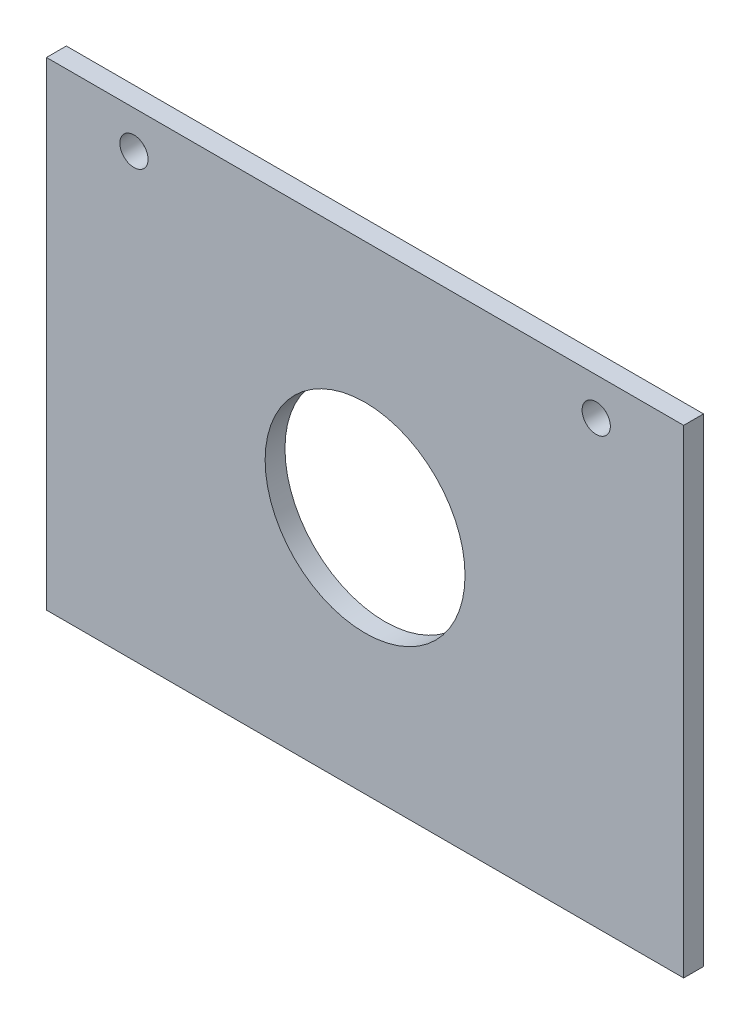
ISO-10303-21;
HEADER;
FILE_DESCRIPTION(('STEP AP214'),'2;1');
FILE_NAME('part.step','',(''),(''),'','','');
FILE_SCHEMA(('AUTOMOTIVE_DESIGN { 1 0 10303 214 1 1 1 1 }'));
ENDSEC;
DATA;
#1=APPLICATION_CONTEXT('core data for automotive mechanical design processes');
#2=APPLICATION_PROTOCOL_DEFINITION('international standard','automotive_design',2000,#1);
#3=PRODUCT_CONTEXT('',#1,'mechanical');
#4=PRODUCT('Part','Part','',(#3));
#5=PRODUCT_RELATED_PRODUCT_CATEGORY('part','',(#4));
#6=PRODUCT_DEFINITION_FORMATION('','',#4);
#7=PRODUCT_DEFINITION_CONTEXT('part definition',#1,'design');
#8=PRODUCT_DEFINITION('design','',#6,#7);
#9=PRODUCT_DEFINITION_SHAPE('','',#8);
#10=(LENGTH_UNIT() NAMED_UNIT(*) SI_UNIT(.MILLI.,.METRE.));
#11=(NAMED_UNIT(*) PLANE_ANGLE_UNIT() SI_UNIT($,.RADIAN.));
#12=(NAMED_UNIT(*) SI_UNIT($,.STERADIAN.) SOLID_ANGLE_UNIT());
#13=UNCERTAINTY_MEASURE_WITH_UNIT(LENGTH_MEASURE(1.E-05),#10,'distance_accuracy_value','');
#14=(GEOMETRIC_REPRESENTATION_CONTEXT(3) GLOBAL_UNCERTAINTY_ASSIGNED_CONTEXT((#13)) GLOBAL_UNIT_ASSIGNED_CONTEXT((#10,
#11,#12)) REPRESENTATION_CONTEXT('',''));
#15=CARTESIAN_POINT('',(0.,0.,0.));
#16=DIRECTION('',(0.,0.,1.));
#17=DIRECTION('',(1.,0.,0.));
#18=AXIS2_PLACEMENT_3D('',#15,#16,#17);
#19=CARTESIAN_POINT('',(0.,0.,1.5875));
#20=DIRECTION('',(0.,0.,1.));
#21=DIRECTION('',(1.,0.,0.));
#22=AXIS2_PLACEMENT_3D('',#19,#20,#21);
#23=PLANE('',#22);
#24=CARTESIAN_POINT('',(44.,35.31,1.5875));
#25=DIRECTION('',(0.,0.,1.));
#26=DIRECTION('',(1.,0.,0.));
#27=AXIS2_PLACEMENT_3D('',#24,#25,#26);
#28=CIRCLE('',#27,1.1303);
#29=CARTESIAN_POINT('',(45.1303,35.31,1.5875));
#30=VERTEX_POINT('',#29);
#31=EDGE_CURVE('E121',#30,#30,#28,.T.);
#32=ORIENTED_EDGE('',*,*,#31,.F.);
#33=EDGE_LOOP('',(#32));
#34=FACE_BOUND('',#33,.T.);
#35=CARTESIAN_POINT('',(7.,35.31,1.5875));
#36=DIRECTION('',(0.,0.,1.));
#37=DIRECTION('',(1.,0.,0.));
#38=AXIS2_PLACEMENT_3D('',#35,#36,#37);
#39=CIRCLE('',#38,1.1303);
#40=CARTESIAN_POINT('',(8.1303,35.31,1.5875));
#41=VERTEX_POINT('',#40);
#42=EDGE_CURVE('E122',#41,#41,#39,.T.);
#43=ORIENTED_EDGE('',*,*,#42,.F.);
#44=EDGE_LOOP('',(#43));
#45=FACE_BOUND('',#44,.T.);
#46=DIRECTION('',(0.,-1.,0.));
#47=VECTOR('',#46,1.);
#48=CARTESIAN_POINT('',(0.,38.31,1.5875));
#49=LINE('',#48,#47);
#50=CARTESIAN_POINT('',(0.,38.31,1.5875));
#51=VERTEX_POINT('',#50);
#52=CARTESIAN_POINT('',(0.,0.,1.5875));
#53=VERTEX_POINT('',#52);
#54=EDGE_CURVE('E85',#51,#53,#49,.T.);
#55=ORIENTED_EDGE('',*,*,#54,.T.);
#56=DIRECTION('',(1.,0.,0.));
#57=VECTOR('',#56,1.);
#58=CARTESIAN_POINT('',(0.,0.,1.5875));
#59=LINE('',#58,#57);
#60=CARTESIAN_POINT('',(51.,0.,1.5875));
#61=VERTEX_POINT('',#60);
#62=EDGE_CURVE('E80',#53,#61,#59,.T.);
#63=ORIENTED_EDGE('',*,*,#62,.T.);
#64=DIRECTION('',(0.,1.,0.));
#65=VECTOR('',#64,1.);
#66=CARTESIAN_POINT('',(51.,38.31,1.5875));
#67=LINE('',#66,#65);
#68=CARTESIAN_POINT('',(51.,38.31,1.5875));
#69=VERTEX_POINT('',#68);
#70=EDGE_CURVE('E83',#61,#69,#67,.T.);
#71=ORIENTED_EDGE('',*,*,#70,.T.);
#72=DIRECTION('',(-1.,0.,0.));
#73=VECTOR('',#72,1.);
#74=CARTESIAN_POINT('',(0.,38.31,1.5875));
#75=LINE('',#74,#73);
#76=EDGE_CURVE('E50',#69,#51,#75,.T.);
#77=ORIENTED_EDGE('',*,*,#76,.T.);
#78=EDGE_LOOP('',(#55,#63,#71,#77));
#79=FACE_BOUND('',#78,.T.);
#80=CARTESIAN_POINT('',(25.5,19.155,1.5875));
#81=DIRECTION('',(0.,0.,1.));
#82=DIRECTION('',(1.,0.,0.));
#83=AXIS2_PLACEMENT_3D('',#80,#81,#82);
#84=CIRCLE('',#83,8.);
#85=CARTESIAN_POINT('',(33.5,19.155,1.5875));
#86=VERTEX_POINT('',#85);
#87=EDGE_CURVE('E100',#86,#86,#84,.T.);
#88=ORIENTED_EDGE('',*,*,#87,.F.);
#89=EDGE_LOOP('',(#88));
#90=FACE_BOUND('',#89,.T.);
#91=ADVANCED_FACE('F33',(#34,#45,#79,#90),#23,.T.);
#92=CARTESIAN_POINT('',(0.,0.,0.));
#93=DIRECTION('',(0.,0.,1.));
#94=DIRECTION('',(1.,0.,0.));
#95=AXIS2_PLACEMENT_3D('',#92,#93,#94);
#96=PLANE('',#95);
#97=CARTESIAN_POINT('',(44.,35.31,0.));
#98=DIRECTION('',(0.,0.,1.));
#99=DIRECTION('',(1.,0.,0.));
#100=AXIS2_PLACEMENT_3D('',#97,#98,#99);
#101=CIRCLE('',#100,1.1303);
#102=CARTESIAN_POINT('',(45.1303,35.31,0.));
#103=VERTEX_POINT('',#102);
#104=EDGE_CURVE('E115',#103,#103,#101,.F.);
#105=ORIENTED_EDGE('',*,*,#104,.F.);
#106=EDGE_LOOP('',(#105));
#107=FACE_BOUND('',#106,.T.);
#108=CARTESIAN_POINT('',(7.,35.31,0.));
#109=DIRECTION('',(0.,0.,1.));
#110=DIRECTION('',(1.,0.,0.));
#111=AXIS2_PLACEMENT_3D('',#108,#109,#110);
#112=CIRCLE('',#111,1.1303);
#113=CARTESIAN_POINT('',(8.1303,35.31,0.));
#114=VERTEX_POINT('',#113);
#115=EDGE_CURVE('E118',#114,#114,#112,.F.);
#116=ORIENTED_EDGE('',*,*,#115,.F.);
#117=EDGE_LOOP('',(#116));
#118=FACE_BOUND('',#117,.T.);
#119=DIRECTION('',(0.,-1.,0.));
#120=VECTOR('',#119,1.);
#121=CARTESIAN_POINT('',(0.,38.31,0.));
#122=LINE('',#121,#120);
#123=CARTESIAN_POINT('',(0.,38.31,0.));
#124=VERTEX_POINT('',#123);
#125=CARTESIAN_POINT('',(0.,0.,0.));
#126=VERTEX_POINT('',#125);
#127=EDGE_CURVE('E97',#124,#126,#122,.T.);
#128=ORIENTED_EDGE('',*,*,#127,.F.);
#129=DIRECTION('',(-1.,0.,0.));
#130=VECTOR('',#129,1.);
#131=CARTESIAN_POINT('',(0.,38.31,0.));
#132=LINE('',#131,#130);
#133=CARTESIAN_POINT('',(51.,38.31,0.));
#134=VERTEX_POINT('',#133);
#135=EDGE_CURVE('E73',#134,#124,#132,.T.);
#136=ORIENTED_EDGE('',*,*,#135,.F.);
#137=DIRECTION('',(0.,1.,0.));
#138=VECTOR('',#137,1.);
#139=CARTESIAN_POINT('',(51.,38.31,0.));
#140=LINE('',#139,#138);
#141=CARTESIAN_POINT('',(51.,0.,0.));
#142=VERTEX_POINT('',#141);
#143=EDGE_CURVE('E67',#142,#134,#140,.T.);
#144=ORIENTED_EDGE('',*,*,#143,.F.);
#145=DIRECTION('',(1.,0.,0.));
#146=VECTOR('',#145,1.);
#147=CARTESIAN_POINT('',(0.,0.,0.));
#148=LINE('',#147,#146);
#149=EDGE_CURVE('E89',#126,#142,#148,.T.);
#150=ORIENTED_EDGE('',*,*,#149,.F.);
#151=EDGE_LOOP('',(#128,#136,#144,#150));
#152=FACE_BOUND('',#151,.T.);
#153=CARTESIAN_POINT('',(25.5,19.155,0.));
#154=DIRECTION('',(0.,0.,1.));
#155=DIRECTION('',(1.,0.,0.));
#156=AXIS2_PLACEMENT_3D('',#153,#154,#155);
#157=CIRCLE('',#156,8.);
#158=CARTESIAN_POINT('',(33.5,19.155,0.));
#159=VERTEX_POINT('',#158);
#160=EDGE_CURVE('E112',#159,#159,#157,.T.);
#161=ORIENTED_EDGE('',*,*,#160,.T.);
#162=EDGE_LOOP('',(#161));
#163=FACE_BOUND('',#162,.T.);
#164=ADVANCED_FACE('F108',(#107,#118,#152,#163),#96,.F.);
#165=CARTESIAN_POINT('',(0.,38.31,1.5875));
#166=DIRECTION('',(1.,0.,0.));
#167=DIRECTION('',(0.,0.,-1.));
#168=AXIS2_PLACEMENT_3D('',#165,#166,#167);
#169=PLANE('',#168);
#170=ORIENTED_EDGE('',*,*,#127,.T.);
#171=DIRECTION('',(0.,0.,-1.));
#172=VECTOR('',#171,1.);
#173=CARTESIAN_POINT('',(0.,0.,1.5875));
#174=LINE('',#173,#172);
#175=EDGE_CURVE('E11',#53,#126,#174,.T.);
#176=ORIENTED_EDGE('',*,*,#175,.F.);
#177=ORIENTED_EDGE('',*,*,#54,.F.);
#178=DIRECTION('',(0.,0.,-1.));
#179=VECTOR('',#178,1.);
#180=CARTESIAN_POINT('',(0.,38.31,1.5875));
#181=LINE('',#180,#179);
#182=EDGE_CURVE('E93',#51,#124,#181,.T.);
#183=ORIENTED_EDGE('',*,*,#182,.T.);
#184=EDGE_LOOP('',(#170,#176,#177,#183));
#185=FACE_BOUND('',#184,.T.);
#186=ADVANCED_FACE('F35',(#185),#169,.F.);
#187=CARTESIAN_POINT('',(0.,0.,1.5875));
#188=DIRECTION('',(0.,1.,0.));
#189=DIRECTION('',(0.,0.,1.));
#190=AXIS2_PLACEMENT_3D('',#187,#188,#189);
#191=PLANE('',#190);
#192=ORIENTED_EDGE('',*,*,#149,.T.);
#193=DIRECTION('',(0.,0.,-1.));
#194=VECTOR('',#193,1.);
#195=CARTESIAN_POINT('',(51.,0.,1.5875));
#196=LINE('',#195,#194);
#197=EDGE_CURVE('E42',#61,#142,#196,.T.);
#198=ORIENTED_EDGE('',*,*,#197,.F.);
#199=ORIENTED_EDGE('',*,*,#62,.F.);
#200=ORIENTED_EDGE('',*,*,#175,.T.);
#201=EDGE_LOOP('',(#192,#198,#199,#200));
#202=FACE_BOUND('',#201,.T.);
#203=ADVANCED_FACE('F88',(#202),#191,.F.);
#204=CARTESIAN_POINT('',(51.,38.31,1.5875));
#205=DIRECTION('',(-1.,0.,0.));
#206=DIRECTION('',(0.,-1.,0.));
#207=AXIS2_PLACEMENT_3D('',#204,#205,#206);
#208=PLANE('',#207);
#209=ORIENTED_EDGE('',*,*,#143,.T.);
#210=DIRECTION('',(0.,0.,-1.));
#211=VECTOR('',#210,1.);
#212=CARTESIAN_POINT('',(51.,38.31,1.5875));
#213=LINE('',#212,#211);
#214=EDGE_CURVE('E90',#69,#134,#213,.T.);
#215=ORIENTED_EDGE('',*,*,#214,.F.);
#216=ORIENTED_EDGE('',*,*,#70,.F.);
#217=ORIENTED_EDGE('',*,*,#197,.T.);
#218=EDGE_LOOP('',(#209,#215,#216,#217));
#219=FACE_BOUND('',#218,.T.);
#220=ADVANCED_FACE('F91',(#219),#208,.F.);
#221=CARTESIAN_POINT('',(0.,38.31,1.5875));
#222=DIRECTION('',(0.,-1.,0.));
#223=DIRECTION('',(0.,0.,-1.));
#224=AXIS2_PLACEMENT_3D('',#221,#222,#223);
#225=PLANE('',#224);
#226=ORIENTED_EDGE('',*,*,#135,.T.);
#227=ORIENTED_EDGE('',*,*,#182,.F.);
#228=ORIENTED_EDGE('',*,*,#76,.F.);
#229=ORIENTED_EDGE('',*,*,#214,.T.);
#230=EDGE_LOOP('',(#226,#227,#228,#229));
#231=FACE_BOUND('',#230,.T.);
#232=ADVANCED_FACE('F105',(#231),#225,.F.);
#233=CARTESIAN_POINT('',(25.5,19.155,1.5875));
#234=DIRECTION('',(0.,0.,-1.));
#235=DIRECTION('',(-1.,0.,0.));
#236=AXIS2_PLACEMENT_3D('',#233,#234,#235);
#237=CYLINDRICAL_SURFACE('',#236,8.);
#238=ORIENTED_EDGE('',*,*,#87,.T.);
#239=EDGE_LOOP('',(#238));
#240=FACE_BOUND('',#239,.T.);
#241=ORIENTED_EDGE('',*,*,#160,.F.);
#242=EDGE_LOOP('',(#241));
#243=FACE_BOUND('',#242,.T.);
#244=ADVANCED_FACE('F139',(#240,#243),#237,.F.);
#245=CARTESIAN_POINT('',(7.,35.31,-3.19697117910062));
#246=DIRECTION('',(0.,0.,1.));
#247=DIRECTION('',(1.,0.,0.));
#248=AXIS2_PLACEMENT_3D('',#245,#246,#247);
#249=CYLINDRICAL_SURFACE('',#248,1.1303);
#250=ORIENTED_EDGE('',*,*,#115,.T.);
#251=EDGE_LOOP('',(#250));
#252=FACE_BOUND('',#251,.T.);
#253=ORIENTED_EDGE('',*,*,#42,.T.);
#254=EDGE_LOOP('',(#253));
#255=FACE_BOUND('',#254,.T.);
#256=ADVANCED_FACE('F137',(#252,#255),#249,.F.);
#257=CARTESIAN_POINT('',(44.,35.31,-3.19697117910062));
#258=DIRECTION('',(0.,0.,1.));
#259=DIRECTION('',(1.,0.,0.));
#260=AXIS2_PLACEMENT_3D('',#257,#258,#259);
#261=CYLINDRICAL_SURFACE('',#260,1.1303);
#262=ORIENTED_EDGE('',*,*,#104,.T.);
#263=EDGE_LOOP('',(#262));
#264=FACE_BOUND('',#263,.T.);
#265=ORIENTED_EDGE('',*,*,#31,.T.);
#266=EDGE_LOOP('',(#265));
#267=FACE_BOUND('',#266,.T.);
#268=ADVANCED_FACE('F130',(#264,#267),#261,.F.);
#269=CLOSED_SHELL('',(#91,#164,#186,#203,#220,#232,#244,#256,#268));
#270=MANIFOLD_SOLID_BREP('B2',#269);
#271=ADVANCED_BREP_SHAPE_REPRESENTATION('',(#18,#270),#14);
#272=SHAPE_DEFINITION_REPRESENTATION(#9,#271);
ENDSEC;
END-ISO-10303-21;
